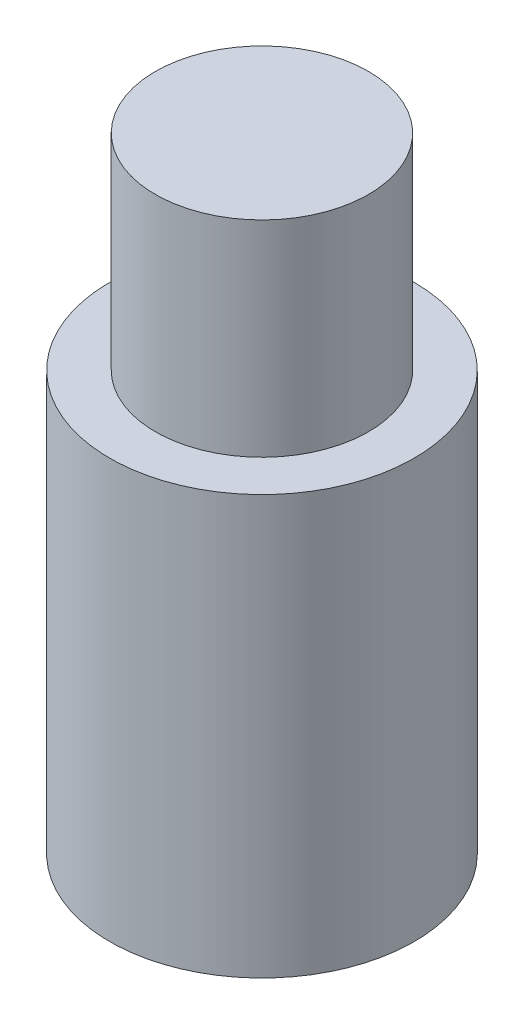
ISO-10303-21;
HEADER;
FILE_DESCRIPTION(('STEP AP214'),'2;1');
FILE_NAME('part.step','',(''),(''),'','','');
FILE_SCHEMA(('AUTOMOTIVE_DESIGN { 1 0 10303 214 1 1 1 1 }'));
ENDSEC;
DATA;
#1=APPLICATION_CONTEXT('core data for automotive mechanical design processes');
#2=APPLICATION_PROTOCOL_DEFINITION('international standard','automotive_design',2000,#1);
#3=PRODUCT_CONTEXT('',#1,'mechanical');
#4=PRODUCT('Part','Part','',(#3));
#5=PRODUCT_RELATED_PRODUCT_CATEGORY('part','',(#4));
#6=PRODUCT_DEFINITION_FORMATION('','',#4);
#7=PRODUCT_DEFINITION_CONTEXT('part definition',#1,'design');
#8=PRODUCT_DEFINITION('design','',#6,#7);
#9=PRODUCT_DEFINITION_SHAPE('','',#8);
#10=(LENGTH_UNIT() NAMED_UNIT(*) SI_UNIT(.MILLI.,.METRE.));
#11=(NAMED_UNIT(*) PLANE_ANGLE_UNIT() SI_UNIT($,.RADIAN.));
#12=(NAMED_UNIT(*) SI_UNIT($,.STERADIAN.) SOLID_ANGLE_UNIT());
#13=UNCERTAINTY_MEASURE_WITH_UNIT(LENGTH_MEASURE(1.E-05),#10,'distance_accuracy_value','');
#14=(GEOMETRIC_REPRESENTATION_CONTEXT(3) GLOBAL_UNCERTAINTY_ASSIGNED_CONTEXT((#13)) GLOBAL_UNIT_ASSIGNED_CONTEXT((#10,
#11,#12)) REPRESENTATION_CONTEXT('',''));
#15=CARTESIAN_POINT('',(0.,0.,0.));
#16=DIRECTION('',(0.,0.,1.));
#17=DIRECTION('',(1.,0.,0.));
#18=AXIS2_PLACEMENT_3D('',#15,#16,#17);
#19=CARTESIAN_POINT('',(0.,5.4,0.));
#20=DIRECTION('',(0.,-1.,0.));
#21=DIRECTION('',(0.,0.,-1.));
#22=AXIS2_PLACEMENT_3D('',#19,#20,#21);
#23=CYLINDRICAL_SURFACE('',#22,2.8);
#24=CARTESIAN_POINT('',(0.,5.4,0.));
#25=DIRECTION('',(0.,1.,0.));
#26=DIRECTION('',(0.,0.,1.));
#27=AXIS2_PLACEMENT_3D('',#24,#25,#26);
#28=CIRCLE('',#27,2.8);
#29=CARTESIAN_POINT('',(0.,5.4,-2.8));
#30=VERTEX_POINT('',#29);
#31=EDGE_CURVE('E10',#30,#30,#28,.T.);
#32=CARTESIAN_POINT('',(0.,0.,0.));
#33=DIRECTION('',(0.,1.,0.));
#34=DIRECTION('',(0.,0.,1.));
#35=AXIS2_PLACEMENT_3D('',#32,#33,#34);
#36=CIRCLE('',#35,2.8);
#37=CARTESIAN_POINT('',(0.,0.,-2.8));
#38=VERTEX_POINT('',#37);
#39=EDGE_CURVE('E40',#38,#38,#36,.T.);
#40=CARTESIAN_POINT('',(0.,5.4,-2.8));
#41=CARTESIAN_POINT('',(0.,5.34375,-2.8));
#42=CARTESIAN_POINT('',(0.,5.2875,-2.8));
#43=CARTESIAN_POINT('',(0.,5.175,-2.8));
#44=CARTESIAN_POINT('',(0.,5.11875,-2.8));
#45=CARTESIAN_POINT('',(0.,5.00625,-2.8));
#46=CARTESIAN_POINT('',(0.,4.95,-2.8));
#47=CARTESIAN_POINT('',(0.,4.8375,-2.8));
#48=CARTESIAN_POINT('',(0.,4.78125,-2.8));
#49=CARTESIAN_POINT('',(0.,4.66875,-2.8));
#50=CARTESIAN_POINT('',(0.,4.6125,-2.8));
#51=CARTESIAN_POINT('',(0.,4.5,-2.8));
#52=CARTESIAN_POINT('',(0.,4.44375,-2.8));
#53=CARTESIAN_POINT('',(0.,4.33125,-2.8));
#54=CARTESIAN_POINT('',(0.,4.275,-2.8));
#55=CARTESIAN_POINT('',(0.,4.1625,-2.8));
#56=CARTESIAN_POINT('',(0.,4.10625,-2.8));
#57=CARTESIAN_POINT('',(0.,3.99375,-2.8));
#58=CARTESIAN_POINT('',(0.,3.9375,-2.8));
#59=CARTESIAN_POINT('',(0.,3.825,-2.8));
#60=CARTESIAN_POINT('',(0.,3.76875,-2.8));
#61=CARTESIAN_POINT('',(0.,3.65625,-2.8));
#62=CARTESIAN_POINT('',(0.,3.6,-2.8));
#63=CARTESIAN_POINT('',(0.,3.4875,-2.8));
#64=CARTESIAN_POINT('',(0.,3.43125,-2.8));
#65=CARTESIAN_POINT('',(0.,3.31875,-2.8));
#66=CARTESIAN_POINT('',(0.,3.2625,-2.8));
#67=CARTESIAN_POINT('',(0.,3.15,-2.8));
#68=CARTESIAN_POINT('',(0.,3.09375,-2.8));
#69=CARTESIAN_POINT('',(0.,2.98125,-2.8));
#70=CARTESIAN_POINT('',(0.,2.925,-2.8));
#71=CARTESIAN_POINT('',(0.,2.8125,-2.8));
#72=CARTESIAN_POINT('',(0.,2.75625,-2.8));
#73=CARTESIAN_POINT('',(0.,2.64375,-2.8));
#74=CARTESIAN_POINT('',(0.,2.5875,-2.8));
#75=CARTESIAN_POINT('',(0.,2.475,-2.8));
#76=CARTESIAN_POINT('',(0.,2.41875,-2.8));
#77=CARTESIAN_POINT('',(0.,2.30625,-2.8));
#78=CARTESIAN_POINT('',(0.,2.25,-2.8));
#79=CARTESIAN_POINT('',(0.,2.1375,-2.8));
#80=CARTESIAN_POINT('',(0.,2.08125,-2.8));
#81=CARTESIAN_POINT('',(0.,1.96875,-2.8));
#82=CARTESIAN_POINT('',(0.,1.9125,-2.8));
#83=CARTESIAN_POINT('',(0.,1.8,-2.8));
#84=CARTESIAN_POINT('',(0.,1.74375,-2.8));
#85=CARTESIAN_POINT('',(0.,1.63125,-2.8));
#86=CARTESIAN_POINT('',(0.,1.575,-2.8));
#87=CARTESIAN_POINT('',(0.,1.4625,-2.8));
#88=CARTESIAN_POINT('',(0.,1.40625,-2.8));
#89=CARTESIAN_POINT('',(0.,1.29375,-2.8));
#90=CARTESIAN_POINT('',(0.,1.2375,-2.8));
#91=CARTESIAN_POINT('',(0.,1.125,-2.8));
#92=CARTESIAN_POINT('',(0.,1.06875,-2.8));
#93=CARTESIAN_POINT('',(0.,0.95625,-2.8));
#94=CARTESIAN_POINT('',(0.,0.9,-2.8));
#95=CARTESIAN_POINT('',(0.,0.7875,-2.8));
#96=CARTESIAN_POINT('',(0.,0.73125,-2.8));
#97=CARTESIAN_POINT('',(0.,0.618749999999999,-2.8));
#98=CARTESIAN_POINT('',(0.,0.562499999999999,-2.8));
#99=CARTESIAN_POINT('',(0.,0.449999999999999,-2.8));
#100=CARTESIAN_POINT('',(0.,0.393749999999999,-2.8));
#101=CARTESIAN_POINT('',(0.,0.281249999999999,-2.8));
#102=CARTESIAN_POINT('',(0.,0.225,-2.8));
#103=CARTESIAN_POINT('',(0.,0.112499999999999,-2.8));
#104=CARTESIAN_POINT('',(0.,0.0562499999999992,-2.8));
#105=CARTESIAN_POINT('',(0.,0.,-2.8));
#106=B_SPLINE_CURVE_WITH_KNOTS('',3,(#40,#41,#42,#43,#44,#45,#46,#47,#48,#49,#50,#51,#52,#53,
#54,#55,#56,#57,#58,#59,#60,#61,#62,#63,#64,#65,#66,#67,#68,#69,#70,#71,#72,#73,#74,#75,#76,#77,
#78,#79,#80,#81,#82,#83,#84,#85,#86,#87,#88,#89,#90,#91,#92,#93,#94,#95,#96,#97,#98,#99,#100,
#101,#102,#103,#104,#105),.UNSPECIFIED.,.F.,.F.,(4,2,2,2,2,2,2,2,2,2,2,2,2,2,2,2,2,2,2,2,2,2,2,
2,2,2,2,2,2,2,2,2,4),(0.,0.168750000000001,0.3375,0.506250000000001,0.675,0.843750000000001,
1.0125,1.18125,1.35,1.51875,1.6875,1.85625,2.025,2.19375,2.3625,2.53125,2.7,2.86875,3.0375,
3.20625,3.375,3.54375,3.7125,3.88125,4.05,4.21875,4.3875,4.55625,4.725,4.89375,5.0625,5.23125,
5.4),.UNSPECIFIED.);
#107=EDGE_CURVE('BSEAM37',#30,#38,#106,.T.);
#108=ORIENTED_EDGE('',*,*,#31,.F.);
#109=ORIENTED_EDGE('',*,*,#39,.T.);
#110=ORIENTED_EDGE('',*,*,#107,.T.);
#111=ORIENTED_EDGE('',*,*,#107,.F.);
#112=EDGE_LOOP('',(#108,#110,#109,#111));
#113=FACE_BOUND('',#112,.T.);
#114=ADVANCED_FACE('F37',(#113),#23,.T.);
#115=CARTESIAN_POINT('',(0.,5.4,0.));
#116=DIRECTION('',(0.,1.,0.));
#117=DIRECTION('',(0.,0.,1.));
#118=AXIS2_PLACEMENT_3D('',#115,#116,#117);
#119=PLANE('',#118);
#120=ORIENTED_EDGE('',*,*,#31,.T.);
#121=EDGE_LOOP('',(#120));
#122=FACE_BOUND('',#121,.T.);
#123=ADVANCED_FACE('F64',(#122),#119,.T.);
#124=CARTESIAN_POINT('',(0.,-11.,0.));
#125=DIRECTION('',(0.,1.,0.));
#126=DIRECTION('',(0.,0.,1.));
#127=AXIS2_PLACEMENT_3D('',#124,#125,#126);
#128=CYLINDRICAL_SURFACE('',#127,4.);
#129=CARTESIAN_POINT('',(0.,-11.,0.));
#130=DIRECTION('',(0.,-1.,0.));
#131=DIRECTION('',(0.,0.,-1.));
#132=AXIS2_PLACEMENT_3D('',#129,#130,#131);
#133=CIRCLE('',#132,4.);
#134=CARTESIAN_POINT('',(0.,-11.,-4.));
#135=VERTEX_POINT('',#134);
#136=EDGE_CURVE('E49',#135,#135,#133,.T.);
#137=ORIENTED_EDGE('',*,*,#136,.F.);
#138=EDGE_LOOP('',(#137));
#139=FACE_BOUND('',#138,.T.);
#140=CARTESIAN_POINT('',(0.,0.,0.));
#141=DIRECTION('',(0.,-1.,0.));
#142=DIRECTION('',(0.,0.,-1.));
#143=AXIS2_PLACEMENT_3D('',#140,#141,#142);
#144=CIRCLE('',#143,4.);
#145=CARTESIAN_POINT('',(0.,0.,-4.));
#146=VERTEX_POINT('',#145);
#147=EDGE_CURVE('E51',#146,#146,#144,.T.);
#148=ORIENTED_EDGE('',*,*,#147,.T.);
#149=EDGE_LOOP('',(#148));
#150=FACE_BOUND('',#149,.T.);
#151=ADVANCED_FACE('F61',(#139,#150),#128,.T.);
#152=CARTESIAN_POINT('',(0.,-11.,0.));
#153=DIRECTION('',(0.,-1.,0.));
#154=DIRECTION('',(0.,0.,-1.));
#155=AXIS2_PLACEMENT_3D('',#152,#153,#154);
#156=PLANE('',#155);
#157=ORIENTED_EDGE('',*,*,#136,.T.);
#158=EDGE_LOOP('',(#157));
#159=FACE_BOUND('',#158,.T.);
#160=ADVANCED_FACE('F59',(#159),#156,.T.);
#161=CARTESIAN_POINT('',(0.,0.,0.));
#162=DIRECTION('',(0.,-1.,0.));
#163=DIRECTION('',(0.,0.,-1.));
#164=AXIS2_PLACEMENT_3D('',#161,#162,#163);
#165=PLANE('',#164);
#166=ORIENTED_EDGE('',*,*,#39,.F.);
#167=EDGE_LOOP('',(#166));
#168=FACE_BOUND('',#167,.T.);
#169=ORIENTED_EDGE('',*,*,#147,.F.);
#170=EDGE_LOOP('',(#169));
#171=FACE_BOUND('',#170,.T.);
#172=ADVANCED_FACE('F68',(#168,#171),#165,.F.);
#173=CLOSED_SHELL('',(#114,#123,#151,#160,#172));
#174=MANIFOLD_SOLID_BREP('B2',#173);
#175=ADVANCED_BREP_SHAPE_REPRESENTATION('',(#18,#174),#14);
#176=SHAPE_DEFINITION_REPRESENTATION(#9,#175);
ENDSEC;
END-ISO-10303-21;
